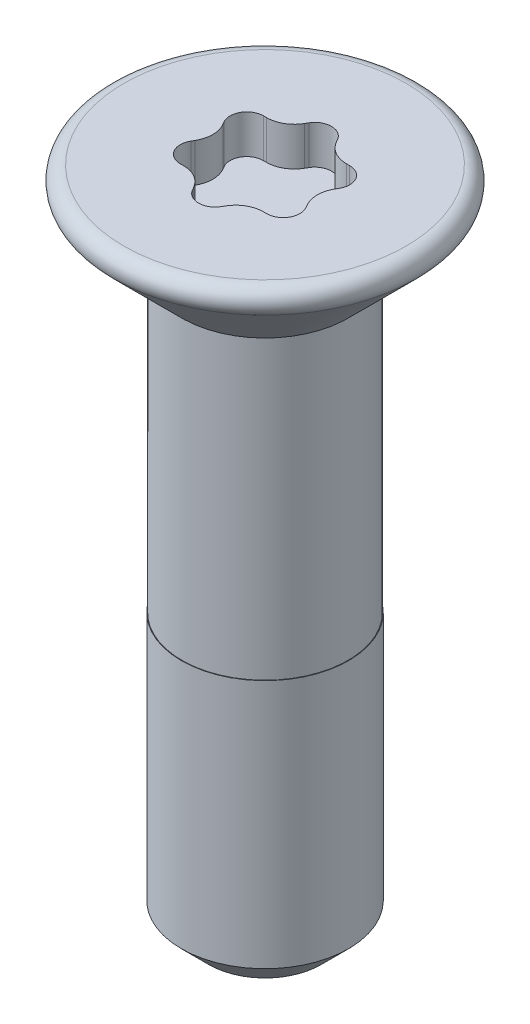
ISO-10303-21;
HEADER;
FILE_DESCRIPTION(('STEP AP214'),'2;1');
FILE_NAME('part.step','',(''),(''),'','','');
FILE_SCHEMA(('AUTOMOTIVE_DESIGN { 1 0 10303 214 1 1 1 1 }'));
ENDSEC;
DATA;
#1=APPLICATION_CONTEXT('core data for automotive mechanical design processes');
#2=APPLICATION_PROTOCOL_DEFINITION('international standard','automotive_design',2000,#1);
#3=PRODUCT_CONTEXT('',#1,'mechanical');
#4=PRODUCT('Part','Part','',(#3));
#5=PRODUCT_RELATED_PRODUCT_CATEGORY('part','',(#4));
#6=PRODUCT_DEFINITION_FORMATION('','',#4);
#7=PRODUCT_DEFINITION_CONTEXT('part definition',#1,'design');
#8=PRODUCT_DEFINITION('design','',#6,#7);
#9=PRODUCT_DEFINITION_SHAPE('','',#8);
#10=(LENGTH_UNIT() NAMED_UNIT(*) SI_UNIT(.MILLI.,.METRE.));
#11=(NAMED_UNIT(*) PLANE_ANGLE_UNIT() SI_UNIT($,.RADIAN.));
#12=(NAMED_UNIT(*) SI_UNIT($,.STERADIAN.) SOLID_ANGLE_UNIT());
#13=UNCERTAINTY_MEASURE_WITH_UNIT(LENGTH_MEASURE(1.E-05),#10,'distance_accuracy_value','');
#14=(GEOMETRIC_REPRESENTATION_CONTEXT(3) GLOBAL_UNCERTAINTY_ASSIGNED_CONTEXT((#13)) GLOBAL_UNIT_ASSIGNED_CONTEXT((#10,
#11,#12)) REPRESENTATION_CONTEXT('',''));
#15=CARTESIAN_POINT('',(0.,0.,0.));
#16=DIRECTION('',(0.,0.,1.));
#17=DIRECTION('',(1.,0.,0.));
#18=AXIS2_PLACEMENT_3D('',#15,#16,#17);
#19=CARTESIAN_POINT('',(-0.721687836487033,-0.7,-1.25));
#20=DIRECTION('',(0.,1.,0.));
#21=DIRECTION('',(0.,0.,1.));
#22=AXIS2_PLACEMENT_3D('',#19,#20,#21);
#23=PLANE('',#22);
#24=CARTESIAN_POINT('',(0.,-0.7,-0.900000000000001));
#25=DIRECTION('',(0.,1.,0.));
#26=DIRECTION('',(0.,0.,1.));
#27=AXIS2_PLACEMENT_3D('',#24,#25,#26);
#28=CIRCLE('',#27,0.3);
#29=CARTESIAN_POINT('',(0.259807621135331,-0.7,-1.05));
#30=VERTEX_POINT('',#29);
#31=CARTESIAN_POINT('',(-0.259807621135332,-0.7,-1.05));
#32=VERTEX_POINT('',#31);
#33=EDGE_CURVE('E265',#30,#32,#28,.T.);
#34=ORIENTED_EDGE('',*,*,#33,.T.);
#35=DIRECTION('',(0.5,0.,-0.866025403784438));
#36=VECTOR('',#35,1.);
#37=CARTESIAN_POINT('',(-0.288675134594814,-0.7,-1.));
#38=LINE('',#37,#36);
#39=CARTESIAN_POINT('',(-0.288675134594814,-0.7,-1.));
#40=VERTEX_POINT('',#39);
#41=EDGE_CURVE('E267',#40,#32,#38,.T.);
#42=ORIENTED_EDGE('',*,*,#41,.F.);
#43=CARTESIAN_POINT('',(-0.721687836487033,-0.7,-1.25));
#44=DIRECTION('',(0.,1.,0.));
#45=DIRECTION('',(0.,0.,1.));
#46=AXIS2_PLACEMENT_3D('',#43,#44,#45);
#47=CIRCLE('',#46,0.5);
#48=CARTESIAN_POINT('',(-0.721687836487033,-0.7,-0.75));
#49=VERTEX_POINT('',#48);
#50=EDGE_CURVE('E261',#49,#40,#47,.T.);
#51=ORIENTED_EDGE('',*,*,#50,.F.);
#52=DIRECTION('',(1.,0.,0.));
#53=VECTOR('',#52,1.);
#54=CARTESIAN_POINT('',(-0.779422863405995,-0.7,-0.75));
#55=LINE('',#54,#53);
#56=CARTESIAN_POINT('',(-0.779422863405995,-0.7,-0.75));
#57=VERTEX_POINT('',#56);
#58=EDGE_CURVE('E183',#57,#49,#55,.T.);
#59=ORIENTED_EDGE('',*,*,#58,.F.);
#60=CARTESIAN_POINT('',(-0.779422863405995,-0.7,-0.45));
#61=DIRECTION('',(0.,1.,0.));
#62=DIRECTION('',(0.,0.,1.));
#63=AXIS2_PLACEMENT_3D('',#60,#61,#62);
#64=CIRCLE('',#63,0.3);
#65=CARTESIAN_POINT('',(-1.03923048454133,-0.7,-0.3));
#66=VERTEX_POINT('',#65);
#67=EDGE_CURVE('E186',#57,#66,#64,.T.);
#68=ORIENTED_EDGE('',*,*,#67,.T.);
#69=DIRECTION('',(-0.500000000000001,0.,-0.866025403784438));
#70=VECTOR('',#69,1.);
#71=CARTESIAN_POINT('',(-1.01036297108185,-0.7,-0.25));
#72=LINE('',#71,#70);
#73=CARTESIAN_POINT('',(-1.01036297108185,-0.7,-0.25));
#74=VERTEX_POINT('',#73);
#75=EDGE_CURVE('E189',#74,#66,#72,.T.);
#76=ORIENTED_EDGE('',*,*,#75,.F.);
#77=CARTESIAN_POINT('',(-1.44337567297407,-0.7,0.));
#78=DIRECTION('',(0.,1.,0.));
#79=DIRECTION('',(0.,0.,1.));
#80=AXIS2_PLACEMENT_3D('',#77,#78,#79);
#81=CIRCLE('',#80,0.5);
#82=CARTESIAN_POINT('',(-1.01036297108185,-0.7,0.249999999999999));
#83=VERTEX_POINT('',#82);
#84=EDGE_CURVE('E202',#83,#74,#81,.T.);
#85=ORIENTED_EDGE('',*,*,#84,.F.);
#86=DIRECTION('',(0.499999999999995,0.,-0.866025403784441));
#87=VECTOR('',#86,1.);
#88=CARTESIAN_POINT('',(-1.03923048454133,-0.7,0.300000000000001));
#89=LINE('',#88,#87);
#90=CARTESIAN_POINT('',(-1.03923048454133,-0.7,0.300000000000001));
#91=VERTEX_POINT('',#90);
#92=EDGE_CURVE('E211',#91,#83,#89,.T.);
#93=ORIENTED_EDGE('',*,*,#92,.F.);
#94=CARTESIAN_POINT('',(-0.779422863405996,-0.7,0.450000000000001));
#95=DIRECTION('',(0.,1.,0.));
#96=DIRECTION('',(0.,0.,1.));
#97=AXIS2_PLACEMENT_3D('',#94,#95,#96);
#98=CIRCLE('',#97,0.3);
#99=CARTESIAN_POINT('',(-0.779422863405997,-0.7,0.75));
#100=VERTEX_POINT('',#99);
#101=EDGE_CURVE('E301',#91,#100,#98,.T.);
#102=ORIENTED_EDGE('',*,*,#101,.T.);
#103=DIRECTION('',(-1.,0.,0.));
#104=VECTOR('',#103,1.);
#105=CARTESIAN_POINT('',(-0.721687836487033,-0.7,0.750000000000001));
#106=LINE('',#105,#104);
#107=CARTESIAN_POINT('',(-0.721687836487031,-0.7,0.750000000000001));
#108=VERTEX_POINT('',#107);
#109=EDGE_CURVE('E303',#108,#100,#106,.T.);
#110=ORIENTED_EDGE('',*,*,#109,.F.);
#111=CARTESIAN_POINT('',(-0.721687836487033,-0.7,1.25));
#112=DIRECTION('',(0.,1.,0.));
#113=DIRECTION('',(0.,0.,1.));
#114=AXIS2_PLACEMENT_3D('',#111,#112,#113);
#115=CIRCLE('',#114,0.5);
#116=CARTESIAN_POINT('',(-0.288675134594814,-0.7,1.));
#117=VERTEX_POINT('',#116);
#118=EDGE_CURVE('E296',#117,#108,#115,.T.);
#119=ORIENTED_EDGE('',*,*,#118,.F.);
#120=DIRECTION('',(-0.500000000000002,0.,-0.866025403784438));
#121=VECTOR('',#120,1.);
#122=CARTESIAN_POINT('',(-0.259807621135332,-0.7,1.05));
#123=LINE('',#122,#121);
#124=CARTESIAN_POINT('',(-0.259807621135331,-0.7,1.05));
#125=VERTEX_POINT('',#124);
#126=EDGE_CURVE('E513',#125,#117,#123,.T.);
#127=ORIENTED_EDGE('',*,*,#126,.F.);
#128=CARTESIAN_POINT('',(0.,-0.7,0.900000000000001));
#129=DIRECTION('',(0.,1.,0.));
#130=DIRECTION('',(0.,0.,1.));
#131=AXIS2_PLACEMENT_3D('',#128,#129,#130);
#132=CIRCLE('',#131,0.3);
#133=CARTESIAN_POINT('',(0.259807621135332,-0.7,1.05));
#134=VERTEX_POINT('',#133);
#135=EDGE_CURVE('E292',#125,#134,#132,.T.);
#136=ORIENTED_EDGE('',*,*,#135,.T.);
#137=DIRECTION('',(-0.499999999999999,0.,0.866025403784439));
#138=VECTOR('',#137,1.);
#139=CARTESIAN_POINT('',(0.288675134594813,-0.7,1.));
#140=LINE('',#139,#138);
#141=CARTESIAN_POINT('',(0.288675134594813,-0.7,1.));
#142=VERTEX_POINT('',#141);
#143=EDGE_CURVE('E294',#142,#134,#140,.T.);
#144=ORIENTED_EDGE('',*,*,#143,.F.);
#145=CARTESIAN_POINT('',(0.721687836487033,-0.7,1.25));
#146=DIRECTION('',(0.,1.,0.));
#147=DIRECTION('',(0.,0.,1.));
#148=AXIS2_PLACEMENT_3D('',#145,#146,#147);
#149=CIRCLE('',#148,0.5);
#150=CARTESIAN_POINT('',(0.721687836487032,-0.7,0.750000000000001));
#151=VERTEX_POINT('',#150);
#152=EDGE_CURVE('E287',#151,#142,#149,.T.);
#153=ORIENTED_EDGE('',*,*,#152,.F.);
#154=DIRECTION('',(-1.,0.,0.));
#155=VECTOR('',#154,1.);
#156=CARTESIAN_POINT('',(0.779422863405995,-0.7,0.750000000000001));
#157=LINE('',#156,#155);
#158=CARTESIAN_POINT('',(0.779422863405995,-0.7,0.750000000000001));
#159=VERTEX_POINT('',#158);
#160=EDGE_CURVE('E503',#159,#151,#157,.T.);
#161=ORIENTED_EDGE('',*,*,#160,.F.);
#162=CARTESIAN_POINT('',(0.779422863405995,-0.7,0.450000000000001));
#163=DIRECTION('',(0.,1.,0.));
#164=DIRECTION('',(0.,0.,1.));
#165=AXIS2_PLACEMENT_3D('',#162,#163,#164);
#166=CIRCLE('',#165,0.3);
#167=CARTESIAN_POINT('',(1.03923048454133,-0.7,0.300000000000001));
#168=VERTEX_POINT('',#167);
#169=EDGE_CURVE('E283',#159,#168,#166,.T.);
#170=ORIENTED_EDGE('',*,*,#169,.T.);
#171=DIRECTION('',(0.499999999999997,0.,0.866025403784441));
#172=VECTOR('',#171,1.);
#173=CARTESIAN_POINT('',(1.01036297108185,-0.7,0.250000000000001));
#174=LINE('',#173,#172);
#175=CARTESIAN_POINT('',(1.01036297108185,-0.7,0.25));
#176=VERTEX_POINT('',#175);
#177=EDGE_CURVE('E285',#176,#168,#174,.T.);
#178=ORIENTED_EDGE('',*,*,#177,.F.);
#179=CARTESIAN_POINT('',(1.44337567297406,-0.7,0.));
#180=DIRECTION('',(0.,1.,0.));
#181=DIRECTION('',(0.,0.,1.));
#182=AXIS2_PLACEMENT_3D('',#179,#180,#181);
#183=CIRCLE('',#182,0.5);
#184=CARTESIAN_POINT('',(1.01036297108185,-0.7,-0.25));
#185=VERTEX_POINT('',#184);
#186=EDGE_CURVE('E278',#185,#176,#183,.T.);
#187=ORIENTED_EDGE('',*,*,#186,.F.);
#188=DIRECTION('',(-0.500000000000003,0.,0.866025403784437));
#189=VECTOR('',#188,1.);
#190=CARTESIAN_POINT('',(1.03923048454133,-0.7,-0.3));
#191=LINE('',#190,#189);
#192=CARTESIAN_POINT('',(1.03923048454133,-0.7,-0.299999999999999));
#193=VERTEX_POINT('',#192);
#194=EDGE_CURVE('E493',#193,#185,#191,.T.);
#195=ORIENTED_EDGE('',*,*,#194,.F.);
#196=CARTESIAN_POINT('',(0.779422863405996,-0.7,-0.45));
#197=DIRECTION('',(0.,1.,0.));
#198=DIRECTION('',(0.,0.,1.));
#199=AXIS2_PLACEMENT_3D('',#196,#197,#198);
#200=CIRCLE('',#199,0.3);
#201=CARTESIAN_POINT('',(0.779422863405996,-0.7,-0.749999999999999));
#202=VERTEX_POINT('',#201);
#203=EDGE_CURVE('E274',#193,#202,#200,.T.);
#204=ORIENTED_EDGE('',*,*,#203,.T.);
#205=DIRECTION('',(1.,0.,0.));
#206=VECTOR('',#205,1.);
#207=CARTESIAN_POINT('',(0.721687836487033,-0.7,-0.749999999999999));
#208=LINE('',#207,#206);
#209=CARTESIAN_POINT('',(0.721687836487033,-0.7,-0.75));
#210=VERTEX_POINT('',#209);
#211=EDGE_CURVE('E276',#210,#202,#208,.T.);
#212=ORIENTED_EDGE('',*,*,#211,.F.);
#213=CARTESIAN_POINT('',(0.721687836487033,-0.7,-1.25));
#214=DIRECTION('',(0.,1.,0.));
#215=DIRECTION('',(0.,0.,1.));
#216=AXIS2_PLACEMENT_3D('',#213,#214,#215);
#217=CIRCLE('',#216,0.5);
#218=CARTESIAN_POINT('',(0.288675134594814,-0.7,-0.999999999999999));
#219=VERTEX_POINT('',#218);
#220=EDGE_CURVE('E269',#219,#210,#217,.T.);
#221=ORIENTED_EDGE('',*,*,#220,.F.);
#222=DIRECTION('',(0.500000000000004,0.,0.866025403784436));
#223=VECTOR('',#222,1.);
#224=CARTESIAN_POINT('',(0.259807621135331,-0.7,-1.05));
#225=LINE('',#224,#223);
#226=EDGE_CURVE('E483',#30,#219,#225,.T.);
#227=ORIENTED_EDGE('',*,*,#226,.F.);
#228=EDGE_LOOP('',(#34,#42,#51,#59,#68,#76,#85,#93,#102,#110,#119,#127,#136,#144,#153,#161,#170,
#178,#187,#195,#204,#212,#221,#227));
#229=FACE_BOUND('',#228,.T.);
#230=ADVANCED_FACE('F17',(#229),#23,.T.);
#231=CARTESIAN_POINT('',(0.,-12.,0.));
#232=DIRECTION('',(0.,-1.,0.));
#233=DIRECTION('',(1.,0.,0.));
#234=AXIS2_PLACEMENT_3D('',#231,#232,#233);
#235=PLANE('',#234);
#236=CARTESIAN_POINT('',(0.,-12.0000000000005,0.));
#237=DIRECTION('',(0.,1.,0.));
#238=DIRECTION('',(0.,0.,1.));
#239=AXIS2_PLACEMENT_3D('',#236,#237,#238);
#240=CIRCLE('',#239,1.01414213560247);
#241=CARTESIAN_POINT('',(0.,-12.0000000000005,1.01414213560247));
#242=VERTEX_POINT('',#241);
#243=EDGE_CURVE('E257',#242,#242,#240,.T.);
#244=ORIENTED_EDGE('',*,*,#243,.F.);
#245=EDGE_LOOP('',(#244));
#246=FACE_BOUND('',#245,.T.);
#247=ADVANCED_FACE('F426',(#246),#235,.T.);
#248=CARTESIAN_POINT('',(-0.779422863405995,-0.7,-0.75));
#249=DIRECTION('',(0.,0.,1.));
#250=DIRECTION('',(1.,0.,0.));
#251=AXIS2_PLACEMENT_3D('',#248,#249,#250);
#252=PLANE('',#251);
#253=ORIENTED_EDGE('',*,*,#58,.T.);
#254=DIRECTION('',(0.,1.,0.));
#255=VECTOR('',#254,1.);
#256=CARTESIAN_POINT('',(-0.721687836487033,-0.7,-0.75));
#257=LINE('',#256,#255);
#258=CARTESIAN_POINT('',(-0.721687836487033,0.,-0.75));
#259=VERTEX_POINT('',#258);
#260=EDGE_CURVE('E264',#259,#49,#257,.F.);
#261=ORIENTED_EDGE('',*,*,#260,.F.);
#262=DIRECTION('',(1.,0.,0.));
#263=VECTOR('',#262,1.);
#264=CARTESIAN_POINT('',(0.,0.,-0.75));
#265=LINE('',#264,#263);
#266=CARTESIAN_POINT('',(-0.779422863405995,0.,-0.75));
#267=VERTEX_POINT('',#266);
#268=EDGE_CURVE('E256',#259,#267,#265,.F.);
#269=ORIENTED_EDGE('',*,*,#268,.T.);
#270=DIRECTION('',(0.,1.,0.));
#271=VECTOR('',#270,1.);
#272=CARTESIAN_POINT('',(-0.779422863405995,-0.7,-0.75));
#273=LINE('',#272,#271);
#274=EDGE_CURVE('E193',#267,#57,#273,.F.);
#275=ORIENTED_EDGE('',*,*,#274,.T.);
#276=EDGE_LOOP('',(#253,#261,#269,#275));
#277=FACE_BOUND('',#276,.T.);
#278=ADVANCED_FACE('F424',(#277),#252,.T.);
#279=CARTESIAN_POINT('',(-0.779422863405995,-0.7,-0.45));
#280=DIRECTION('',(0.,1.,0.));
#281=DIRECTION('',(0.,0.,1.));
#282=AXIS2_PLACEMENT_3D('',#279,#280,#281);
#283=CYLINDRICAL_SURFACE('',#282,0.3);
#284=DIRECTION('',(0.,1.,0.));
#285=VECTOR('',#284,1.);
#286=CARTESIAN_POINT('',(-1.03923048454133,-0.7,-0.3));
#287=LINE('',#286,#285);
#288=CARTESIAN_POINT('',(-1.03923048454133,0.,-0.3));
#289=VERTEX_POINT('',#288);
#290=EDGE_CURVE('E196',#66,#289,#287,.T.);
#291=ORIENTED_EDGE('',*,*,#290,.F.);
#292=ORIENTED_EDGE('',*,*,#67,.F.);
#293=ORIENTED_EDGE('',*,*,#274,.F.);
#294=CARTESIAN_POINT('',(-0.779422863405995,0.,-0.45));
#295=DIRECTION('',(0.,1.,0.));
#296=DIRECTION('',(0.,0.,1.));
#297=AXIS2_PLACEMENT_3D('',#294,#295,#296);
#298=CIRCLE('',#297,0.3);
#299=EDGE_CURVE('E199',#267,#289,#298,.T.);
#300=ORIENTED_EDGE('',*,*,#299,.T.);
#301=EDGE_LOOP('',(#291,#292,#293,#300));
#302=FACE_BOUND('',#301,.T.);
#303=ADVANCED_FACE('F197',(#302),#283,.F.);
#304=CARTESIAN_POINT('',(-1.01036297108185,-0.7,-0.25));
#305=DIRECTION('',(0.866025403784438,0.,-0.500000000000001));
#306=DIRECTION('',(-0.500000000000001,0.,-0.866025403784438));
#307=AXIS2_PLACEMENT_3D('',#304,#305,#306);
#308=PLANE('',#307);
#309=ORIENTED_EDGE('',*,*,#75,.T.);
#310=ORIENTED_EDGE('',*,*,#290,.T.);
#311=DIRECTION('',(0.499999999999999,0.,0.866025403784439));
#312=VECTOR('',#311,1.);
#313=CARTESIAN_POINT('',(-1.03923048454133,0.,-0.3));
#314=LINE('',#313,#312);
#315=CARTESIAN_POINT('',(-1.01036297108185,0.,-0.249999999999999));
#316=VERTEX_POINT('',#315);
#317=EDGE_CURVE('E254',#289,#316,#314,.T.);
#318=ORIENTED_EDGE('',*,*,#317,.T.);
#319=DIRECTION('',(0.,1.,0.));
#320=VECTOR('',#319,1.);
#321=CARTESIAN_POINT('',(-1.01036297108185,-0.7,-0.25));
#322=LINE('',#321,#320);
#323=EDGE_CURVE('E206',#74,#316,#322,.T.);
#324=ORIENTED_EDGE('',*,*,#323,.F.);
#325=EDGE_LOOP('',(#309,#310,#318,#324));
#326=FACE_BOUND('',#325,.T.);
#327=ADVANCED_FACE('F204',(#326),#308,.T.);
#328=CARTESIAN_POINT('',(-1.44337567297407,-0.7,0.));
#329=DIRECTION('',(0.,1.,0.));
#330=DIRECTION('',(0.,0.,1.));
#331=AXIS2_PLACEMENT_3D('',#328,#329,#330);
#332=CYLINDRICAL_SURFACE('',#331,0.5);
#333=ORIENTED_EDGE('',*,*,#84,.T.);
#334=ORIENTED_EDGE('',*,*,#323,.T.);
#335=CARTESIAN_POINT('',(-1.44337567297407,0.,0.));
#336=DIRECTION('',(0.,1.,0.));
#337=DIRECTION('',(0.,0.,1.));
#338=AXIS2_PLACEMENT_3D('',#335,#336,#337);
#339=CIRCLE('',#338,0.5);
#340=CARTESIAN_POINT('',(-1.01036297108185,0.,0.249999999999999));
#341=VERTEX_POINT('',#340);
#342=EDGE_CURVE('E252',#316,#341,#339,.F.);
#343=ORIENTED_EDGE('',*,*,#342,.T.);
#344=DIRECTION('',(0.,1.,0.));
#345=VECTOR('',#344,1.);
#346=CARTESIAN_POINT('',(-1.01036297108185,-0.7,0.25));
#347=LINE('',#346,#345);
#348=EDGE_CURVE('E520',#83,#341,#347,.T.);
#349=ORIENTED_EDGE('',*,*,#348,.F.);
#350=EDGE_LOOP('',(#333,#334,#343,#349));
#351=FACE_BOUND('',#350,.T.);
#352=ADVANCED_FACE('F415',(#351),#332,.T.);
#353=CARTESIAN_POINT('',(-1.03923048454133,-0.7,0.300000000000001));
#354=DIRECTION('',(0.866025403784441,0.,0.499999999999995));
#355=DIRECTION('',(0.499999999999995,0.,-0.866025403784441));
#356=AXIS2_PLACEMENT_3D('',#353,#354,#355);
#357=PLANE('',#356);
#358=ORIENTED_EDGE('',*,*,#92,.T.);
#359=ORIENTED_EDGE('',*,*,#348,.T.);
#360=DIRECTION('',(-0.499999999999995,0.,0.866025403784441));
#361=VECTOR('',#360,1.);
#362=CARTESIAN_POINT('',(-1.01036297108185,0.,0.25));
#363=LINE('',#362,#361);
#364=CARTESIAN_POINT('',(-1.03923048454133,0.,0.300000000000001));
#365=VERTEX_POINT('',#364);
#366=EDGE_CURVE('E251',#341,#365,#363,.T.);
#367=ORIENTED_EDGE('',*,*,#366,.T.);
#368=DIRECTION('',(0.,1.,0.));
#369=VECTOR('',#368,1.);
#370=CARTESIAN_POINT('',(-1.03923048454133,-0.7,0.300000000000001));
#371=LINE('',#370,#369);
#372=EDGE_CURVE('E304',#365,#91,#371,.F.);
#373=ORIENTED_EDGE('',*,*,#372,.T.);
#374=EDGE_LOOP('',(#358,#359,#367,#373));
#375=FACE_BOUND('',#374,.T.);
#376=ADVANCED_FACE('F411',(#375),#357,.T.);
#377=CARTESIAN_POINT('',(-0.779422863405996,-0.7,0.450000000000001));
#378=DIRECTION('',(0.,1.,0.));
#379=DIRECTION('',(0.,0.,1.));
#380=AXIS2_PLACEMENT_3D('',#377,#378,#379);
#381=CYLINDRICAL_SURFACE('',#380,0.3);
#382=DIRECTION('',(0.,1.,0.));
#383=VECTOR('',#382,1.);
#384=CARTESIAN_POINT('',(-0.779422863405996,-0.7,0.75));
#385=LINE('',#384,#383);
#386=CARTESIAN_POINT('',(-0.779422863405996,0.,0.75));
#387=VERTEX_POINT('',#386);
#388=EDGE_CURVE('E300',#100,#387,#385,.T.);
#389=ORIENTED_EDGE('',*,*,#388,.F.);
#390=ORIENTED_EDGE('',*,*,#101,.F.);
#391=ORIENTED_EDGE('',*,*,#372,.F.);
#392=CARTESIAN_POINT('',(-0.779422863405996,0.,0.450000000000001));
#393=DIRECTION('',(0.,1.,0.));
#394=DIRECTION('',(0.,0.,1.));
#395=AXIS2_PLACEMENT_3D('',#392,#393,#394);
#396=CIRCLE('',#395,0.3);
#397=EDGE_CURVE('E249',#365,#387,#396,.T.);
#398=ORIENTED_EDGE('',*,*,#397,.T.);
#399=EDGE_LOOP('',(#389,#390,#391,#398));
#400=FACE_BOUND('',#399,.T.);
#401=ADVANCED_FACE('F407',(#400),#381,.F.);
#402=CARTESIAN_POINT('',(-0.721687836487033,-0.7,0.750000000000001));
#403=DIRECTION('',(0.,0.,-1.));
#404=DIRECTION('',(-1.,0.,0.));
#405=AXIS2_PLACEMENT_3D('',#402,#403,#404);
#406=PLANE('',#405);
#407=ORIENTED_EDGE('',*,*,#109,.T.);
#408=ORIENTED_EDGE('',*,*,#388,.T.);
#409=DIRECTION('',(1.,0.,0.));
#410=VECTOR('',#409,1.);
#411=CARTESIAN_POINT('',(0.,0.,0.75));
#412=LINE('',#411,#410);
#413=CARTESIAN_POINT('',(-0.721687836487033,0.,0.75));
#414=VERTEX_POINT('',#413);
#415=EDGE_CURVE('E248',#387,#414,#412,.T.);
#416=ORIENTED_EDGE('',*,*,#415,.T.);
#417=DIRECTION('',(0.,1.,0.));
#418=VECTOR('',#417,1.);
#419=CARTESIAN_POINT('',(-0.721687836487033,-0.7,0.750000000000001));
#420=LINE('',#419,#418);
#421=EDGE_CURVE('E299',#108,#414,#420,.T.);
#422=ORIENTED_EDGE('',*,*,#421,.F.);
#423=EDGE_LOOP('',(#407,#408,#416,#422));
#424=FACE_BOUND('',#423,.T.);
#425=ADVANCED_FACE('F403',(#424),#406,.T.);
#426=CARTESIAN_POINT('',(-0.721687836487033,-0.7,1.25));
#427=DIRECTION('',(0.,1.,0.));
#428=DIRECTION('',(0.,0.,1.));
#429=AXIS2_PLACEMENT_3D('',#426,#427,#428);
#430=CYLINDRICAL_SURFACE('',#429,0.5);
#431=ORIENTED_EDGE('',*,*,#118,.T.);
#432=ORIENTED_EDGE('',*,*,#421,.T.);
#433=CARTESIAN_POINT('',(-0.721687836487033,0.,1.25));
#434=DIRECTION('',(0.,1.,0.));
#435=DIRECTION('',(0.,0.,1.));
#436=AXIS2_PLACEMENT_3D('',#433,#434,#435);
#437=CIRCLE('',#436,0.5);
#438=CARTESIAN_POINT('',(-0.288675134594814,0.,1.));
#439=VERTEX_POINT('',#438);
#440=EDGE_CURVE('E246',#414,#439,#437,.F.);
#441=ORIENTED_EDGE('',*,*,#440,.T.);
#442=DIRECTION('',(0.,1.,0.));
#443=VECTOR('',#442,1.);
#444=CARTESIAN_POINT('',(-0.288675134594813,-0.7,1.));
#445=LINE('',#444,#443);
#446=EDGE_CURVE('E510',#117,#439,#445,.T.);
#447=ORIENTED_EDGE('',*,*,#446,.F.);
#448=EDGE_LOOP('',(#431,#432,#441,#447));
#449=FACE_BOUND('',#448,.T.);
#450=ADVANCED_FACE('F399',(#449),#430,.T.);
#451=CARTESIAN_POINT('',(-0.259807621135332,-0.7,1.05));
#452=DIRECTION('',(0.866025403784438,0.,-0.500000000000002));
#453=DIRECTION('',(-0.500000000000002,0.,-0.866025403784438));
#454=AXIS2_PLACEMENT_3D('',#451,#452,#453);
#455=PLANE('',#454);
#456=ORIENTED_EDGE('',*,*,#126,.T.);
#457=ORIENTED_EDGE('',*,*,#446,.T.);
#458=DIRECTION('',(0.500000000000002,0.,0.866025403784438));
#459=VECTOR('',#458,1.);
#460=CARTESIAN_POINT('',(-0.288675134594813,0.,1.));
#461=LINE('',#460,#459);
#462=CARTESIAN_POINT('',(-0.259807621135331,0.,1.05));
#463=VERTEX_POINT('',#462);
#464=EDGE_CURVE('E245',#439,#463,#461,.T.);
#465=ORIENTED_EDGE('',*,*,#464,.T.);
#466=DIRECTION('',(0.,1.,0.));
#467=VECTOR('',#466,1.);
#468=CARTESIAN_POINT('',(-0.259807621135332,-0.7,1.05));
#469=LINE('',#468,#467);
#470=EDGE_CURVE('E295',#463,#125,#469,.F.);
#471=ORIENTED_EDGE('',*,*,#470,.T.);
#472=EDGE_LOOP('',(#456,#457,#465,#471));
#473=FACE_BOUND('',#472,.T.);
#474=ADVANCED_FACE('F395',(#473),#455,.T.);
#475=CARTESIAN_POINT('',(0.,-0.7,0.900000000000001));
#476=DIRECTION('',(0.,1.,0.));
#477=DIRECTION('',(0.,0.,1.));
#478=AXIS2_PLACEMENT_3D('',#475,#476,#477);
#479=CYLINDRICAL_SURFACE('',#478,0.3);
#480=ORIENTED_EDGE('',*,*,#135,.F.);
#481=ORIENTED_EDGE('',*,*,#470,.F.);
#482=CARTESIAN_POINT('',(0.,0.,0.900000000000001));
#483=DIRECTION('',(0.,1.,0.));
#484=DIRECTION('',(0.,0.,1.));
#485=AXIS2_PLACEMENT_3D('',#482,#483,#484);
#486=CIRCLE('',#485,0.3);
#487=CARTESIAN_POINT('',(0.259807621135332,0.,1.05));
#488=VERTEX_POINT('',#487);
#489=EDGE_CURVE('E243',#463,#488,#486,.T.);
#490=ORIENTED_EDGE('',*,*,#489,.T.);
#491=DIRECTION('',(0.,1.,0.));
#492=VECTOR('',#491,1.);
#493=CARTESIAN_POINT('',(0.259807621135332,-0.7,1.05));
#494=LINE('',#493,#492);
#495=EDGE_CURVE('E291',#134,#488,#494,.T.);
#496=ORIENTED_EDGE('',*,*,#495,.F.);
#497=EDGE_LOOP('',(#480,#481,#490,#496));
#498=FACE_BOUND('',#497,.T.);
#499=ADVANCED_FACE('F391',(#498),#479,.F.);
#500=CARTESIAN_POINT('',(0.288675134594813,-0.7,1.));
#501=DIRECTION('',(-0.866025403784439,0.,-0.499999999999999));
#502=DIRECTION('',(-0.499999999999999,0.,0.866025403784439));
#503=AXIS2_PLACEMENT_3D('',#500,#501,#502);
#504=PLANE('',#503);
#505=ORIENTED_EDGE('',*,*,#143,.T.);
#506=ORIENTED_EDGE('',*,*,#495,.T.);
#507=DIRECTION('',(0.499999999999997,0.,-0.86602540378444));
#508=VECTOR('',#507,1.);
#509=CARTESIAN_POINT('',(0.259807621135332,0.,1.05));
#510=LINE('',#509,#508);
#511=CARTESIAN_POINT('',(0.288675134594813,0.,1.));
#512=VERTEX_POINT('',#511);
#513=EDGE_CURVE('E242',#488,#512,#510,.T.);
#514=ORIENTED_EDGE('',*,*,#513,.T.);
#515=DIRECTION('',(0.,1.,0.));
#516=VECTOR('',#515,1.);
#517=CARTESIAN_POINT('',(0.288675134594814,-0.7,1.));
#518=LINE('',#517,#516);
#519=EDGE_CURVE('E290',#142,#512,#518,.T.);
#520=ORIENTED_EDGE('',*,*,#519,.F.);
#521=EDGE_LOOP('',(#505,#506,#514,#520));
#522=FACE_BOUND('',#521,.T.);
#523=ADVANCED_FACE('F387',(#522),#504,.T.);
#524=CARTESIAN_POINT('',(0.721687836487033,-0.7,1.25));
#525=DIRECTION('',(0.,1.,0.));
#526=DIRECTION('',(0.,0.,1.));
#527=AXIS2_PLACEMENT_3D('',#524,#525,#526);
#528=CYLINDRICAL_SURFACE('',#527,0.5);
#529=ORIENTED_EDGE('',*,*,#152,.T.);
#530=ORIENTED_EDGE('',*,*,#519,.T.);
#531=CARTESIAN_POINT('',(0.721687836487033,0.,1.25));
#532=DIRECTION('',(0.,1.,0.));
#533=DIRECTION('',(0.,0.,1.));
#534=AXIS2_PLACEMENT_3D('',#531,#532,#533);
#535=CIRCLE('',#534,0.5);
#536=CARTESIAN_POINT('',(0.721687836487033,0.,0.750000000000001));
#537=VERTEX_POINT('',#536);
#538=EDGE_CURVE('E240',#512,#537,#535,.F.);
#539=ORIENTED_EDGE('',*,*,#538,.T.);
#540=DIRECTION('',(0.,1.,0.));
#541=VECTOR('',#540,1.);
#542=CARTESIAN_POINT('',(0.721687836487033,-0.7,0.750000000000001));
#543=LINE('',#542,#541);
#544=EDGE_CURVE('E500',#151,#537,#543,.T.);
#545=ORIENTED_EDGE('',*,*,#544,.F.);
#546=EDGE_LOOP('',(#529,#530,#539,#545));
#547=FACE_BOUND('',#546,.T.);
#548=ADVANCED_FACE('F383',(#547),#528,.T.);
#549=CARTESIAN_POINT('',(0.779422863405995,-0.7,0.750000000000001));
#550=DIRECTION('',(0.,0.,-1.));
#551=DIRECTION('',(-1.,0.,0.));
#552=AXIS2_PLACEMENT_3D('',#549,#550,#551);
#553=PLANE('',#552);
#554=ORIENTED_EDGE('',*,*,#160,.T.);
#555=ORIENTED_EDGE('',*,*,#544,.T.);
#556=DIRECTION('',(1.,0.,0.));
#557=VECTOR('',#556,1.);
#558=CARTESIAN_POINT('',(0.,0.,0.750000000000001));
#559=LINE('',#558,#557);
#560=CARTESIAN_POINT('',(0.779422863405995,0.,0.750000000000001));
#561=VERTEX_POINT('',#560);
#562=EDGE_CURVE('E239',#537,#561,#559,.T.);
#563=ORIENTED_EDGE('',*,*,#562,.T.);
#564=DIRECTION('',(0.,1.,0.));
#565=VECTOR('',#564,1.);
#566=CARTESIAN_POINT('',(0.779422863405995,-0.7,0.750000000000001));
#567=LINE('',#566,#565);
#568=EDGE_CURVE('E286',#561,#159,#567,.F.);
#569=ORIENTED_EDGE('',*,*,#568,.T.);
#570=EDGE_LOOP('',(#554,#555,#563,#569));
#571=FACE_BOUND('',#570,.T.);
#572=ADVANCED_FACE('F379',(#571),#553,.T.);
#573=CARTESIAN_POINT('',(0.779422863405995,-0.7,0.450000000000001));
#574=DIRECTION('',(0.,1.,0.));
#575=DIRECTION('',(0.,0.,1.));
#576=AXIS2_PLACEMENT_3D('',#573,#574,#575);
#577=CYLINDRICAL_SURFACE('',#576,0.3);
#578=DIRECTION('',(0.,1.,0.));
#579=VECTOR('',#578,1.);
#580=CARTESIAN_POINT('',(1.03923048454133,-0.7,0.300000000000001));
#581=LINE('',#580,#579);
#582=CARTESIAN_POINT('',(1.03923048454133,0.,0.300000000000001));
#583=VERTEX_POINT('',#582);
#584=EDGE_CURVE('E282',#168,#583,#581,.T.);
#585=ORIENTED_EDGE('',*,*,#584,.F.);
#586=ORIENTED_EDGE('',*,*,#169,.F.);
#587=ORIENTED_EDGE('',*,*,#568,.F.);
#588=CARTESIAN_POINT('',(0.779422863405995,0.,0.450000000000001));
#589=DIRECTION('',(0.,1.,0.));
#590=DIRECTION('',(0.,0.,1.));
#591=AXIS2_PLACEMENT_3D('',#588,#589,#590);
#592=CIRCLE('',#591,0.3);
#593=EDGE_CURVE('E237',#561,#583,#592,.T.);
#594=ORIENTED_EDGE('',*,*,#593,.T.);
#595=EDGE_LOOP('',(#585,#586,#587,#594));
#596=FACE_BOUND('',#595,.T.);
#597=ADVANCED_FACE('F375',(#596),#577,.F.);
#598=CARTESIAN_POINT('',(1.01036297108185,-0.7,0.250000000000001));
#599=DIRECTION('',(-0.866025403784441,0.,0.499999999999997));
#600=DIRECTION('',(0.499999999999997,0.,0.866025403784441));
#601=AXIS2_PLACEMENT_3D('',#598,#599,#600);
#602=PLANE('',#601);
#603=ORIENTED_EDGE('',*,*,#177,.T.);
#604=ORIENTED_EDGE('',*,*,#584,.T.);
#605=DIRECTION('',(-0.499999999999996,0.,-0.866025403784441));
#606=VECTOR('',#605,1.);
#607=CARTESIAN_POINT('',(1.03923048454133,0.,0.300000000000001));
#608=LINE('',#607,#606);
#609=CARTESIAN_POINT('',(1.01036297108185,0.,0.249999999999999));
#610=VERTEX_POINT('',#609);
#611=EDGE_CURVE('E236',#583,#610,#608,.T.);
#612=ORIENTED_EDGE('',*,*,#611,.T.);
#613=DIRECTION('',(0.,1.,0.));
#614=VECTOR('',#613,1.);
#615=CARTESIAN_POINT('',(1.01036297108185,-0.7,0.25));
#616=LINE('',#615,#614);
#617=EDGE_CURVE('E281',#176,#610,#616,.T.);
#618=ORIENTED_EDGE('',*,*,#617,.F.);
#619=EDGE_LOOP('',(#603,#604,#612,#618));
#620=FACE_BOUND('',#619,.T.);
#621=ADVANCED_FACE('F371',(#620),#602,.T.);
#622=CARTESIAN_POINT('',(1.44337567297406,-0.7,0.));
#623=DIRECTION('',(0.,1.,0.));
#624=DIRECTION('',(0.,0.,1.));
#625=AXIS2_PLACEMENT_3D('',#622,#623,#624);
#626=CYLINDRICAL_SURFACE('',#625,0.5);
#627=ORIENTED_EDGE('',*,*,#186,.T.);
#628=ORIENTED_EDGE('',*,*,#617,.T.);
#629=CARTESIAN_POINT('',(1.44337567297406,0.,0.));
#630=DIRECTION('',(0.,1.,0.));
#631=DIRECTION('',(0.,0.,1.));
#632=AXIS2_PLACEMENT_3D('',#629,#630,#631);
#633=CIRCLE('',#632,0.5);
#634=CARTESIAN_POINT('',(1.01036297108185,0.,-0.249999999999999));
#635=VERTEX_POINT('',#634);
#636=EDGE_CURVE('E234',#610,#635,#633,.F.);
#637=ORIENTED_EDGE('',*,*,#636,.T.);
#638=DIRECTION('',(0.,1.,0.));
#639=VECTOR('',#638,1.);
#640=CARTESIAN_POINT('',(1.01036297108185,-0.7,-0.249999999999999));
#641=LINE('',#640,#639);
#642=EDGE_CURVE('E490',#185,#635,#641,.T.);
#643=ORIENTED_EDGE('',*,*,#642,.F.);
#644=EDGE_LOOP('',(#627,#628,#637,#643));
#645=FACE_BOUND('',#644,.T.);
#646=ADVANCED_FACE('F367',(#645),#626,.T.);
#647=CARTESIAN_POINT('',(1.03923048454133,-0.7,-0.3));
#648=DIRECTION('',(-0.866025403784437,0.,-0.500000000000003));
#649=DIRECTION('',(-0.500000000000003,0.,0.866025403784437));
#650=AXIS2_PLACEMENT_3D('',#647,#648,#649);
#651=PLANE('',#650);
#652=ORIENTED_EDGE('',*,*,#194,.T.);
#653=ORIENTED_EDGE('',*,*,#642,.T.);
#654=DIRECTION('',(0.499999999999997,0.,-0.866025403784441));
#655=VECTOR('',#654,1.);
#656=CARTESIAN_POINT('',(1.01036297108185,0.,-0.249999999999999));
#657=LINE('',#656,#655);
#658=CARTESIAN_POINT('',(1.03923048454133,0.,-0.3));
#659=VERTEX_POINT('',#658);
#660=EDGE_CURVE('E233',#635,#659,#657,.T.);
#661=ORIENTED_EDGE('',*,*,#660,.T.);
#662=DIRECTION('',(0.,1.,0.));
#663=VECTOR('',#662,1.);
#664=CARTESIAN_POINT('',(1.03923048454133,-0.7,-0.3));
#665=LINE('',#664,#663);
#666=EDGE_CURVE('E277',#659,#193,#665,.F.);
#667=ORIENTED_EDGE('',*,*,#666,.T.);
#668=EDGE_LOOP('',(#652,#653,#661,#667));
#669=FACE_BOUND('',#668,.T.);
#670=ADVANCED_FACE('F363',(#669),#651,.T.);
#671=CARTESIAN_POINT('',(0.779422863405996,-0.7,-0.45));
#672=DIRECTION('',(0.,1.,0.));
#673=DIRECTION('',(0.,0.,1.));
#674=AXIS2_PLACEMENT_3D('',#671,#672,#673);
#675=CYLINDRICAL_SURFACE('',#674,0.3);
#676=DIRECTION('',(0.,1.,0.));
#677=VECTOR('',#676,1.);
#678=CARTESIAN_POINT('',(0.779422863405996,-0.7,-0.749999999999999));
#679=LINE('',#678,#677);
#680=CARTESIAN_POINT('',(0.779422863405996,0.,-0.75));
#681=VERTEX_POINT('',#680);
#682=EDGE_CURVE('E273',#202,#681,#679,.T.);
#683=ORIENTED_EDGE('',*,*,#682,.F.);
#684=ORIENTED_EDGE('',*,*,#203,.F.);
#685=ORIENTED_EDGE('',*,*,#666,.F.);
#686=CARTESIAN_POINT('',(0.779422863405996,0.,-0.45));
#687=DIRECTION('',(0.,1.,0.));
#688=DIRECTION('',(0.,0.,1.));
#689=AXIS2_PLACEMENT_3D('',#686,#687,#688);
#690=CIRCLE('',#689,0.3);
#691=EDGE_CURVE('E231',#659,#681,#690,.T.);
#692=ORIENTED_EDGE('',*,*,#691,.T.);
#693=EDGE_LOOP('',(#683,#684,#685,#692));
#694=FACE_BOUND('',#693,.T.);
#695=ADVANCED_FACE('F359',(#694),#675,.F.);
#696=CARTESIAN_POINT('',(0.721687836487033,-0.7,-0.749999999999999));
#697=DIRECTION('',(0.,0.,1.));
#698=DIRECTION('',(1.,0.,0.));
#699=AXIS2_PLACEMENT_3D('',#696,#697,#698);
#700=PLANE('',#699);
#701=ORIENTED_EDGE('',*,*,#211,.T.);
#702=ORIENTED_EDGE('',*,*,#682,.T.);
#703=DIRECTION('',(1.,0.,0.));
#704=VECTOR('',#703,1.);
#705=CARTESIAN_POINT('',(0.,0.,-0.75));
#706=LINE('',#705,#704);
#707=CARTESIAN_POINT('',(0.721687836487033,0.,-0.75));
#708=VERTEX_POINT('',#707);
#709=EDGE_CURVE('E230',#681,#708,#706,.F.);
#710=ORIENTED_EDGE('',*,*,#709,.T.);
#711=DIRECTION('',(0.,1.,0.));
#712=VECTOR('',#711,1.);
#713=CARTESIAN_POINT('',(0.721687836487033,-0.7,-0.75));
#714=LINE('',#713,#712);
#715=EDGE_CURVE('E272',#210,#708,#714,.T.);
#716=ORIENTED_EDGE('',*,*,#715,.F.);
#717=EDGE_LOOP('',(#701,#702,#710,#716));
#718=FACE_BOUND('',#717,.T.);
#719=ADVANCED_FACE('F355',(#718),#700,.T.);
#720=CARTESIAN_POINT('',(0.721687836487033,-0.7,-1.25));
#721=DIRECTION('',(0.,1.,0.));
#722=DIRECTION('',(0.,0.,1.));
#723=AXIS2_PLACEMENT_3D('',#720,#721,#722);
#724=CYLINDRICAL_SURFACE('',#723,0.5);
#725=ORIENTED_EDGE('',*,*,#220,.T.);
#726=ORIENTED_EDGE('',*,*,#715,.T.);
#727=CARTESIAN_POINT('',(0.721687836487033,0.,-1.25));
#728=DIRECTION('',(0.,1.,0.));
#729=DIRECTION('',(0.,0.,1.));
#730=AXIS2_PLACEMENT_3D('',#727,#728,#729);
#731=CIRCLE('',#730,0.5);
#732=CARTESIAN_POINT('',(0.288675134594814,0.,-0.999999999999999));
#733=VERTEX_POINT('',#732);
#734=EDGE_CURVE('E228',#708,#733,#731,.F.);
#735=ORIENTED_EDGE('',*,*,#734,.T.);
#736=DIRECTION('',(0.,1.,0.));
#737=VECTOR('',#736,1.);
#738=CARTESIAN_POINT('',(0.288675134594813,-0.7,-1.));
#739=LINE('',#738,#737);
#740=EDGE_CURVE('E480',#219,#733,#739,.T.);
#741=ORIENTED_EDGE('',*,*,#740,.F.);
#742=EDGE_LOOP('',(#725,#726,#735,#741));
#743=FACE_BOUND('',#742,.T.);
#744=ADVANCED_FACE('F351',(#743),#724,.T.);
#745=CARTESIAN_POINT('',(0.259807621135331,-0.7,-1.05));
#746=DIRECTION('',(-0.866025403784436,0.,0.500000000000004));
#747=DIRECTION('',(0.500000000000004,0.,0.866025403784436));
#748=AXIS2_PLACEMENT_3D('',#745,#746,#747);
#749=PLANE('',#748);
#750=ORIENTED_EDGE('',*,*,#226,.T.);
#751=ORIENTED_EDGE('',*,*,#740,.T.);
#752=DIRECTION('',(-0.500000000000003,0.,-0.866025403784437));
#753=VECTOR('',#752,1.);
#754=CARTESIAN_POINT('',(0.288675134594813,0.,-1.));
#755=LINE('',#754,#753);
#756=CARTESIAN_POINT('',(0.259807621135331,0.,-1.05));
#757=VERTEX_POINT('',#756);
#758=EDGE_CURVE('E227',#733,#757,#755,.T.);
#759=ORIENTED_EDGE('',*,*,#758,.T.);
#760=DIRECTION('',(0.,1.,0.));
#761=VECTOR('',#760,1.);
#762=CARTESIAN_POINT('',(0.259807621135331,-0.7,-1.05));
#763=LINE('',#762,#761);
#764=EDGE_CURVE('E268',#757,#30,#763,.F.);
#765=ORIENTED_EDGE('',*,*,#764,.T.);
#766=EDGE_LOOP('',(#750,#751,#759,#765));
#767=FACE_BOUND('',#766,.T.);
#768=ADVANCED_FACE('F347',(#767),#749,.T.);
#769=CARTESIAN_POINT('',(0.,-0.7,-0.900000000000001));
#770=DIRECTION('',(0.,1.,0.));
#771=DIRECTION('',(0.,0.,1.));
#772=AXIS2_PLACEMENT_3D('',#769,#770,#771);
#773=CYLINDRICAL_SURFACE('',#772,0.3);
#774=DIRECTION('',(0.,1.,0.));
#775=VECTOR('',#774,1.);
#776=CARTESIAN_POINT('',(-0.259807621135332,-0.7,-1.05));
#777=LINE('',#776,#775);
#778=CARTESIAN_POINT('',(-0.259807621135332,0.,-1.05));
#779=VERTEX_POINT('',#778);
#780=EDGE_CURVE('E475',#32,#779,#777,.T.);
#781=ORIENTED_EDGE('',*,*,#780,.F.);
#782=ORIENTED_EDGE('',*,*,#33,.F.);
#783=ORIENTED_EDGE('',*,*,#764,.F.);
#784=CARTESIAN_POINT('',(0.,0.,-0.900000000000001));
#785=DIRECTION('',(0.,1.,0.));
#786=DIRECTION('',(0.,0.,1.));
#787=AXIS2_PLACEMENT_3D('',#784,#785,#786);
#788=CIRCLE('',#787,0.3);
#789=EDGE_CURVE('E225',#757,#779,#788,.T.);
#790=ORIENTED_EDGE('',*,*,#789,.T.);
#791=EDGE_LOOP('',(#781,#782,#783,#790));
#792=FACE_BOUND('',#791,.T.);
#793=ADVANCED_FACE('F343',(#792),#773,.F.);
#794=CARTESIAN_POINT('',(-0.288675134594814,-0.7,-1.));
#795=DIRECTION('',(0.866025403784438,0.,0.5));
#796=DIRECTION('',(0.5,0.,-0.866025403784438));
#797=AXIS2_PLACEMENT_3D('',#794,#795,#796);
#798=PLANE('',#797);
#799=ORIENTED_EDGE('',*,*,#41,.T.);
#800=ORIENTED_EDGE('',*,*,#780,.T.);
#801=DIRECTION('',(-0.500000000000001,0.,0.866025403784438));
#802=VECTOR('',#801,1.);
#803=CARTESIAN_POINT('',(-0.259807621135332,0.,-1.05));
#804=LINE('',#803,#802);
#805=CARTESIAN_POINT('',(-0.288675134594814,0.,-0.999999999999999));
#806=VERTEX_POINT('',#805);
#807=EDGE_CURVE('E224',#779,#806,#804,.T.);
#808=ORIENTED_EDGE('',*,*,#807,.T.);
#809=DIRECTION('',(0.,1.,0.));
#810=VECTOR('',#809,1.);
#811=CARTESIAN_POINT('',(-0.288675134594814,-0.7,-1.));
#812=LINE('',#811,#810);
#813=EDGE_CURVE('E260',#40,#806,#812,.T.);
#814=ORIENTED_EDGE('',*,*,#813,.F.);
#815=EDGE_LOOP('',(#799,#800,#808,#814));
#816=FACE_BOUND('',#815,.T.);
#817=ADVANCED_FACE('F339',(#816),#798,.T.);
#818=CARTESIAN_POINT('',(-0.721687836487033,-0.7,-1.25));
#819=DIRECTION('',(0.,1.,0.));
#820=DIRECTION('',(0.,0.,1.));
#821=AXIS2_PLACEMENT_3D('',#818,#819,#820);
#822=CYLINDRICAL_SURFACE('',#821,0.5);
#823=ORIENTED_EDGE('',*,*,#50,.T.);
#824=ORIENTED_EDGE('',*,*,#813,.T.);
#825=CARTESIAN_POINT('',(-0.721687836487033,0.,-1.25));
#826=DIRECTION('',(0.,1.,0.));
#827=DIRECTION('',(0.,0.,1.));
#828=AXIS2_PLACEMENT_3D('',#825,#826,#827);
#829=CIRCLE('',#828,0.5);
#830=EDGE_CURVE('E220',#806,#259,#829,.F.);
#831=ORIENTED_EDGE('',*,*,#830,.T.);
#832=ORIENTED_EDGE('',*,*,#260,.T.);
#833=EDGE_LOOP('',(#823,#824,#831,#832));
#834=FACE_BOUND('',#833,.T.);
#835=ADVANCED_FACE('F335',(#834),#822,.T.);
#836=CARTESIAN_POINT('',(0.,-11.5041421357205,0.));
#837=DIRECTION('',(0.,1.,0.));
#838=DIRECTION('',(0.,0.,1.));
#839=AXIS2_PLACEMENT_3D('',#836,#837,#838);
#840=CONICAL_SURFACE('',#839,1.50999999993928,0.785398163454767);
#841=ORIENTED_EDGE('',*,*,#243,.T.);
#842=EDGE_LOOP('',(#841));
#843=FACE_BOUND('',#842,.T.);
#844=CARTESIAN_POINT('',(0.,-11.5041421356237,0.));
#845=DIRECTION('',(0.,1.,0.));
#846=DIRECTION('',(0.,0.,1.));
#847=AXIS2_PLACEMENT_3D('',#844,#845,#846);
#848=CIRCLE('',#847,1.51);
#849=CARTESIAN_POINT('',(0.,-11.5041421356237,1.51));
#850=VERTEX_POINT('',#849);
#851=EDGE_CURVE('E223',#850,#850,#848,.T.);
#852=ORIENTED_EDGE('',*,*,#851,.F.);
#853=EDGE_LOOP('',(#852));
#854=FACE_BOUND('',#853,.T.);
#855=ADVANCED_FACE('F330',(#843,#854),#840,.T.);
#856=CARTESIAN_POINT('',(0.,0.,0.));
#857=DIRECTION('',(0.,-1.,0.));
#858=DIRECTION('',(0.,0.,-1.));
#859=AXIS2_PLACEMENT_3D('',#856,#857,#858);
#860=PLANE('',#859);
#861=ORIENTED_EDGE('',*,*,#807,.F.);
#862=ORIENTED_EDGE('',*,*,#789,.F.);
#863=ORIENTED_EDGE('',*,*,#758,.F.);
#864=ORIENTED_EDGE('',*,*,#734,.F.);
#865=ORIENTED_EDGE('',*,*,#709,.F.);
#866=ORIENTED_EDGE('',*,*,#691,.F.);
#867=ORIENTED_EDGE('',*,*,#660,.F.);
#868=ORIENTED_EDGE('',*,*,#636,.F.);
#869=ORIENTED_EDGE('',*,*,#611,.F.);
#870=ORIENTED_EDGE('',*,*,#593,.F.);
#871=ORIENTED_EDGE('',*,*,#562,.F.);
#872=ORIENTED_EDGE('',*,*,#538,.F.);
#873=ORIENTED_EDGE('',*,*,#513,.F.);
#874=ORIENTED_EDGE('',*,*,#489,.F.);
#875=ORIENTED_EDGE('',*,*,#464,.F.);
#876=ORIENTED_EDGE('',*,*,#440,.F.);
#877=ORIENTED_EDGE('',*,*,#415,.F.);
#878=ORIENTED_EDGE('',*,*,#397,.F.);
#879=ORIENTED_EDGE('',*,*,#366,.F.);
#880=ORIENTED_EDGE('',*,*,#342,.F.);
#881=ORIENTED_EDGE('',*,*,#317,.F.);
#882=ORIENTED_EDGE('',*,*,#299,.F.);
#883=ORIENTED_EDGE('',*,*,#268,.F.);
#884=ORIENTED_EDGE('',*,*,#830,.F.);
#885=EDGE_LOOP('',(#861,#862,#863,#864,#865,#866,#867,#868,#869,#870,#871,#872,#873,#874,#875,
#876,#877,#878,#879,#880,#881,#882,#883,#884));
#886=FACE_BOUND('',#885,.T.);
#887=CARTESIAN_POINT('',(0.,0.,0.));
#888=DIRECTION('',(0.,-1.,0.));
#889=DIRECTION('',(0.,0.,-1.));
#890=AXIS2_PLACEMENT_3D('',#887,#888,#889);
#891=CIRCLE('',#890,2.54644660940672);
#892=CARTESIAN_POINT('',(0.,0.,-2.54644660940672));
#893=VERTEX_POINT('',#892);
#894=CARTESIAN_POINT('',(0.,0.,2.54644660940672));
#895=VERTEX_POINT('',#894);
#896=EDGE_CURVE('E36',#893,#895,#891,.T.);
#897=ORIENTED_EDGE('',*,*,#896,.F.);
#898=CARTESIAN_POINT('',(0.,0.,0.));
#899=DIRECTION('',(0.,-1.,0.));
#900=DIRECTION('',(0.,0.,1.));
#901=AXIS2_PLACEMENT_3D('',#898,#899,#900);
#902=CIRCLE('',#901,2.54644660940672);
#903=EDGE_CURVE('E219',#895,#893,#902,.T.);
#904=ORIENTED_EDGE('',*,*,#903,.F.);
#905=EDGE_LOOP('',(#897,#904));
#906=FACE_BOUND('',#905,.T.);
#907=ADVANCED_FACE('F310',(#886,#906),#860,.F.);
#908=CARTESIAN_POINT('',(0.,0.,0.));
#909=DIRECTION('',(0.,1.,0.));
#910=DIRECTION('',(0.,0.,1.));
#911=AXIS2_PLACEMENT_3D('',#908,#909,#910);
#912=CYLINDRICAL_SURFACE('',#911,1.51);
#913=ORIENTED_EDGE('',*,*,#851,.T.);
#914=EDGE_LOOP('',(#913));
#915=FACE_BOUND('',#914,.T.);
#916=CARTESIAN_POINT('',(0.,-7.,0.));
#917=DIRECTION('',(0.,1.,0.));
#918=DIRECTION('',(0.,0.,1.));
#919=AXIS2_PLACEMENT_3D('',#916,#917,#918);
#920=CIRCLE('',#919,1.51);
#921=CARTESIAN_POINT('',(0.,-7.,1.51));
#922=VERTEX_POINT('',#921);
#923=EDGE_CURVE('E216',#922,#922,#920,.T.);
#924=ORIENTED_EDGE('',*,*,#923,.F.);
#925=EDGE_LOOP('',(#924));
#926=FACE_BOUND('',#925,.T.);
#927=ADVANCED_FACE('F329',(#915,#926),#912,.T.);
#928=CARTESIAN_POINT('',(0.,-0.25,0.));
#929=DIRECTION('',(0.,-1.,0.));
#930=DIRECTION('',(0.,0.,-1.));
#931=AXIS2_PLACEMENT_3D('',#928,#929,#930);
#932=TOROIDAL_SURFACE('',#931,2.54644660940672,0.25);
#933=ORIENTED_EDGE('',*,*,#896,.T.);
#934=ORIENTED_EDGE('',*,*,#903,.T.);
#935=EDGE_LOOP('',(#933,#934));
#936=FACE_BOUND('',#935,.T.);
#937=CARTESIAN_POINT('',(0.,-0.426776695348963,0.));
#938=DIRECTION('',(0.,1.,0.));
#939=DIRECTION('',(0.,0.,1.));
#940=AXIS2_PLACEMENT_3D('',#937,#938,#939);
#941=CIRCLE('',#940,2.72322330471297);
#942=CARTESIAN_POINT('',(0.,-0.426776695348963,2.72322330471297));
#943=VERTEX_POINT('',#942);
#944=EDGE_CURVE('E215',#943,#943,#941,.F.);
#945=ORIENTED_EDGE('',*,*,#944,.F.);
#946=EDGE_LOOP('',(#945));
#947=FACE_BOUND('',#946,.T.);
#948=ADVANCED_FACE('F306',(#936,#947),#932,.T.);
#949=CARTESIAN_POINT('',(-1.5,-7.,0.));
#950=DIRECTION('',(0.,1.,0.));
#951=DIRECTION('',(0.,0.,1.));
#952=AXIS2_PLACEMENT_3D('',#949,#950,#951);
#953=PLANE('',#952);
#954=CARTESIAN_POINT('',(0.,-7.,0.));
#955=DIRECTION('',(0.,1.,0.));
#956=DIRECTION('',(-1.,0.,0.));
#957=AXIS2_PLACEMENT_3D('',#954,#955,#956);
#958=CIRCLE('',#957,1.5);
#959=CARTESIAN_POINT('',(-1.5,-7.,0.));
#960=VERTEX_POINT('',#959);
#961=EDGE_CURVE('E28',#960,#960,#958,.T.);
#962=ORIENTED_EDGE('',*,*,#961,.F.);
#963=EDGE_LOOP('',(#962));
#964=FACE_BOUND('',#963,.T.);
#965=ORIENTED_EDGE('',*,*,#923,.T.);
#966=EDGE_LOOP('',(#965));
#967=FACE_BOUND('',#966,.T.);
#968=ADVANCED_FACE('F443',(#964,#967),#953,.T.);
#969=CARTESIAN_POINT('',(0.,-0.426776695405806,0.));
#970=DIRECTION('',(0.,1.,0.));
#971=DIRECTION('',(-1.,0.,0.));
#972=AXIS2_PLACEMENT_3D('',#969,#970,#971);
#973=CONICAL_SURFACE('',#972,2.72322330459929,0.785398163397448);
#974=CARTESIAN_POINT('',(0.,-1.65,0.));
#975=DIRECTION('',(0.,1.,0.));
#976=DIRECTION('',(-1.,0.,0.));
#977=AXIS2_PLACEMENT_3D('',#974,#975,#976);
#978=CIRCLE('',#977,1.5);
#979=CARTESIAN_POINT('',(-1.5,-1.65,0.));
#980=VERTEX_POINT('',#979);
#981=EDGE_CURVE('E11',#980,#980,#978,.F.);
#982=ORIENTED_EDGE('',*,*,#981,.F.);
#983=EDGE_LOOP('',(#982));
#984=FACE_BOUND('',#983,.T.);
#985=ORIENTED_EDGE('',*,*,#944,.T.);
#986=EDGE_LOOP('',(#985));
#987=FACE_BOUND('',#986,.T.);
#988=ADVANCED_FACE('F437',(#984,#987),#973,.T.);
#989=CARTESIAN_POINT('',(0.,-1.65,0.));
#990=DIRECTION('',(0.,1.,0.));
#991=DIRECTION('',(-1.,0.,0.));
#992=AXIS2_PLACEMENT_3D('',#989,#990,#991);
#993=CYLINDRICAL_SURFACE('',#992,1.5);
#994=ORIENTED_EDGE('',*,*,#981,.T.);
#995=EDGE_LOOP('',(#994));
#996=FACE_BOUND('',#995,.T.);
#997=ORIENTED_EDGE('',*,*,#961,.T.);
#998=EDGE_LOOP('',(#997));
#999=FACE_BOUND('',#998,.T.);
#1000=ADVANCED_FACE('F435',(#996,#999),#993,.T.);
#1001=CLOSED_SHELL('',(#230,#247,#278,#303,#327,#352,#376,#401,#425,#450,#474,#499,#523,#548,
#572,#597,#621,#646,#670,#695,#719,#744,#768,#793,#817,#835,#855,#907,#927,#948,#968,#988,#1000));
#1002=MANIFOLD_SOLID_BREP('B1',#1001);
#1003=ADVANCED_BREP_SHAPE_REPRESENTATION('',(#18,#1002),#14);
#1004=SHAPE_DEFINITION_REPRESENTATION(#9,#1003);
ENDSEC;
END-ISO-10303-21;
